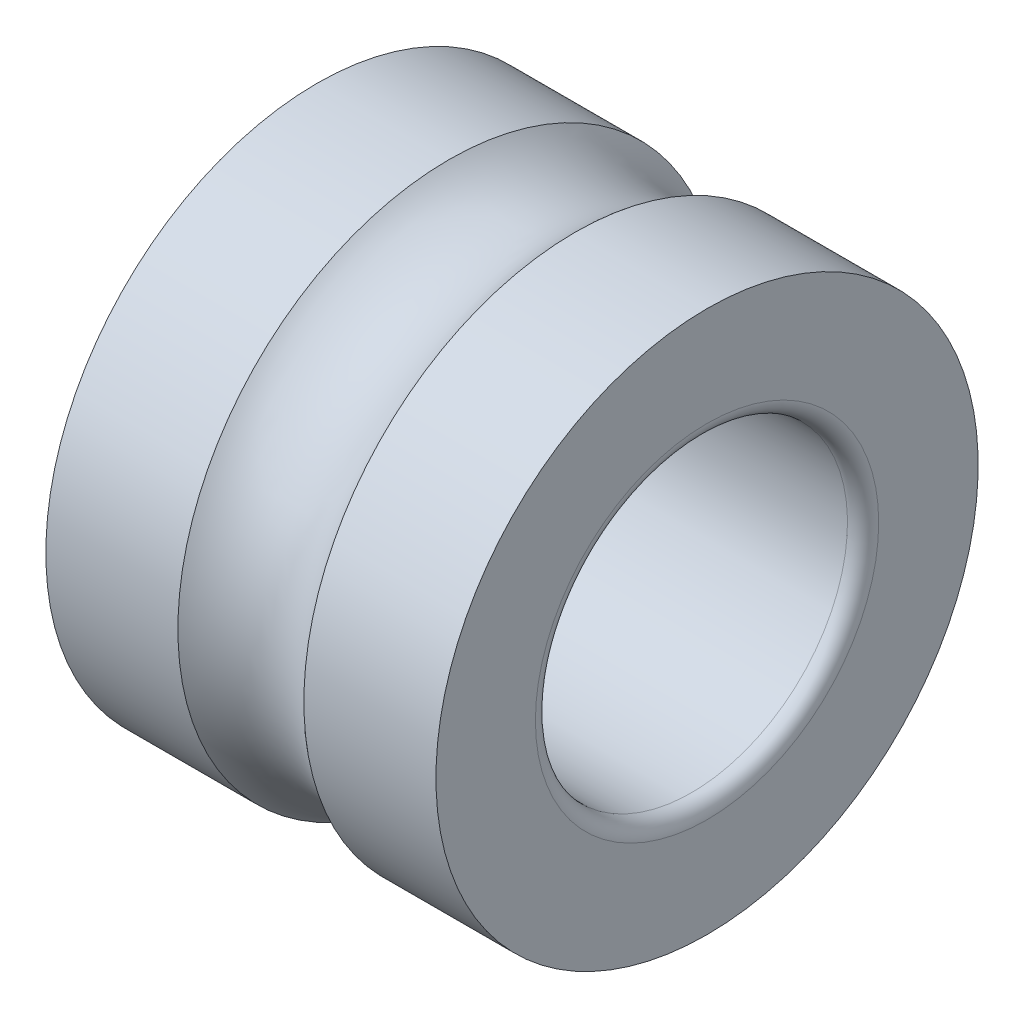
ISO-10303-21;
HEADER;
FILE_DESCRIPTION(('STEP AP214'),'2;1');
FILE_NAME('part.step','',(''),(''),'','','');
FILE_SCHEMA(('AUTOMOTIVE_DESIGN { 1 0 10303 214 1 1 1 1 }'));
ENDSEC;
DATA;
#1=APPLICATION_CONTEXT('core data for automotive mechanical design processes');
#2=APPLICATION_PROTOCOL_DEFINITION('international standard','automotive_design',2000,#1);
#3=PRODUCT_CONTEXT('',#1,'mechanical');
#4=PRODUCT('Part','Part','',(#3));
#5=PRODUCT_RELATED_PRODUCT_CATEGORY('part','',(#4));
#6=PRODUCT_DEFINITION_FORMATION('','',#4);
#7=PRODUCT_DEFINITION_CONTEXT('part definition',#1,'design');
#8=PRODUCT_DEFINITION('design','',#6,#7);
#9=PRODUCT_DEFINITION_SHAPE('','',#8);
#10=(LENGTH_UNIT() NAMED_UNIT(*) SI_UNIT(.MILLI.,.METRE.));
#11=(NAMED_UNIT(*) PLANE_ANGLE_UNIT() SI_UNIT($,.RADIAN.));
#12=(NAMED_UNIT(*) SI_UNIT($,.STERADIAN.) SOLID_ANGLE_UNIT());
#13=UNCERTAINTY_MEASURE_WITH_UNIT(LENGTH_MEASURE(1.E-05),#10,'distance_accuracy_value','');
#14=(GEOMETRIC_REPRESENTATION_CONTEXT(3) GLOBAL_UNCERTAINTY_ASSIGNED_CONTEXT((#13)) GLOBAL_UNIT_ASSIGNED_CONTEXT((#10,
#11,#12)) REPRESENTATION_CONTEXT('',''));
#15=CARTESIAN_POINT('',(0.,0.,0.));
#16=DIRECTION('',(0.,0.,1.));
#17=DIRECTION('',(1.,0.,0.));
#18=AXIS2_PLACEMENT_3D('',#15,#16,#17);
#19=CARTESIAN_POINT('',(4.15362892921594,0.,0.));
#20=DIRECTION('',(-1.,0.,0.));
#21=DIRECTION('',(0.,1.,0.));
#22=AXIS2_PLACEMENT_3D('',#19,#20,#21);
#23=CYLINDRICAL_SURFACE('',#22,3.475);
#24=CARTESIAN_POINT('',(3.30725785843187,0.,0.));
#25=DIRECTION('',(1.,0.,0.));
#26=DIRECTION('',(0.,1.,0.));
#27=AXIS2_PLACEMENT_3D('',#24,#25,#26);
#28=CIRCLE('',#27,3.475);
#29=CARTESIAN_POINT('',(3.30725785843187,3.475,0.));
#30=VERTEX_POINT('',#29);
#31=EDGE_CURVE('E11',#30,#30,#28,.T.);
#32=ORIENTED_EDGE('',*,*,#31,.T.);
#33=EDGE_LOOP('',(#32));
#34=FACE_BOUND('',#33,.T.);
#35=CARTESIAN_POINT('',(5.,0.,0.));
#36=DIRECTION('',(1.,0.,0.));
#37=DIRECTION('',(0.,1.,0.));
#38=AXIS2_PLACEMENT_3D('',#35,#36,#37);
#39=CIRCLE('',#38,3.475);
#40=CARTESIAN_POINT('',(5.,3.475,0.));
#41=VERTEX_POINT('',#40);
#42=EDGE_CURVE('E52',#41,#41,#39,.T.);
#43=ORIENTED_EDGE('',*,*,#42,.F.);
#44=EDGE_LOOP('',(#43));
#45=FACE_BOUND('',#44,.T.);
#46=ADVANCED_FACE('F16',(#34,#45),#23,.T.);
#47=CARTESIAN_POINT('',(2.5,0.,0.));
#48=DIRECTION('',(1.,0.,0.));
#49=DIRECTION('',(0.,0.,-1.));
#50=AXIS2_PLACEMENT_3D('',#47,#48,#49);
#51=TOROIDAL_SURFACE('',#50,4.35,1.1905);
#52=CARTESIAN_POINT('',(1.69274214156813,0.,0.));
#53=DIRECTION('',(1.,0.,0.));
#54=DIRECTION('',(0.,1.,0.));
#55=AXIS2_PLACEMENT_3D('',#52,#53,#54);
#56=CIRCLE('',#55,3.475);
#57=CARTESIAN_POINT('',(1.69274214156813,3.475,0.));
#58=VERTEX_POINT('',#57);
#59=EDGE_CURVE('E26',#58,#58,#56,.T.);
#60=ORIENTED_EDGE('',*,*,#59,.T.);
#61=EDGE_LOOP('',(#60));
#62=FACE_BOUND('',#61,.T.);
#63=ORIENTED_EDGE('',*,*,#31,.F.);
#64=EDGE_LOOP('',(#63));
#65=FACE_BOUND('',#64,.T.);
#66=ADVANCED_FACE('F72',(#62,#65),#51,.F.);
#67=CARTESIAN_POINT('',(0.846371070784067,0.,0.));
#68=DIRECTION('',(-1.,0.,0.));
#69=DIRECTION('',(0.,1.,0.));
#70=AXIS2_PLACEMENT_3D('',#67,#68,#69);
#71=CYLINDRICAL_SURFACE('',#70,3.475);
#72=CARTESIAN_POINT('',(0.,0.,0.));
#73=DIRECTION('',(1.,0.,0.));
#74=DIRECTION('',(0.,1.,0.));
#75=AXIS2_PLACEMENT_3D('',#72,#73,#74);
#76=CIRCLE('',#75,3.475);
#77=CARTESIAN_POINT('',(0.,3.475,0.));
#78=VERTEX_POINT('',#77);
#79=EDGE_CURVE('E56',#78,#78,#76,.T.);
#80=ORIENTED_EDGE('',*,*,#79,.T.);
#81=EDGE_LOOP('',(#80));
#82=FACE_BOUND('',#81,.T.);
#83=ORIENTED_EDGE('',*,*,#59,.F.);
#84=EDGE_LOOP('',(#83));
#85=FACE_BOUND('',#84,.T.);
#86=ADVANCED_FACE('F75',(#82,#85),#71,.T.);
#87=CARTESIAN_POINT('',(0.,2.8375,0.));
#88=DIRECTION('',(-1.,0.,0.));
#89=DIRECTION('',(0.,-1.,0.));
#90=AXIS2_PLACEMENT_3D('',#87,#88,#89);
#91=PLANE('',#90);
#92=CARTESIAN_POINT('',(0.,0.,0.));
#93=DIRECTION('',(1.,0.,0.));
#94=DIRECTION('',(0.,1.,0.));
#95=AXIS2_PLACEMENT_3D('',#92,#93,#94);
#96=CIRCLE('',#95,2.2);
#97=CARTESIAN_POINT('',(0.,2.2,0.));
#98=VERTEX_POINT('',#97);
#99=EDGE_CURVE('E60',#98,#98,#96,.T.);
#100=ORIENTED_EDGE('',*,*,#99,.T.);
#101=EDGE_LOOP('',(#100));
#102=FACE_BOUND('',#101,.T.);
#103=ORIENTED_EDGE('',*,*,#79,.F.);
#104=EDGE_LOOP('',(#103));
#105=FACE_BOUND('',#104,.T.);
#106=ADVANCED_FACE('F61',(#102,#105),#91,.T.);
#107=CARTESIAN_POINT('',(0.2,0.,0.));
#108=DIRECTION('',(1.,0.,0.));
#109=DIRECTION('',(0.,0.,-1.));
#110=AXIS2_PLACEMENT_3D('',#107,#108,#109);
#111=TOROIDAL_SURFACE('',#110,2.2,0.2);
#112=CARTESIAN_POINT('',(0.2,0.,0.));
#113=DIRECTION('',(1.,0.,0.));
#114=DIRECTION('',(0.,1.,0.));
#115=AXIS2_PLACEMENT_3D('',#112,#113,#114);
#116=CIRCLE('',#115,2.);
#117=CARTESIAN_POINT('',(0.2,2.,0.));
#118=VERTEX_POINT('',#117);
#119=EDGE_CURVE('E20',#118,#118,#116,.T.);
#120=ORIENTED_EDGE('',*,*,#119,.T.);
#121=EDGE_LOOP('',(#120));
#122=FACE_BOUND('',#121,.T.);
#123=ORIENTED_EDGE('',*,*,#99,.F.);
#124=EDGE_LOOP('',(#123));
#125=FACE_BOUND('',#124,.T.);
#126=ADVANCED_FACE('F83',(#122,#125),#111,.T.);
#127=CARTESIAN_POINT('',(2.5,0.,0.));
#128=DIRECTION('',(-1.,0.,0.));
#129=DIRECTION('',(0.,1.,0.));
#130=AXIS2_PLACEMENT_3D('',#127,#128,#129);
#131=CYLINDRICAL_SURFACE('',#130,2.);
#132=CARTESIAN_POINT('',(4.8,0.,0.));
#133=DIRECTION('',(1.,0.,0.));
#134=DIRECTION('',(0.,1.,0.));
#135=AXIS2_PLACEMENT_3D('',#132,#133,#134);
#136=CIRCLE('',#135,2.);
#137=CARTESIAN_POINT('',(4.8,2.,0.));
#138=VERTEX_POINT('',#137);
#139=EDGE_CURVE('E46',#138,#138,#136,.T.);
#140=ORIENTED_EDGE('',*,*,#139,.T.);
#141=EDGE_LOOP('',(#140));
#142=FACE_BOUND('',#141,.T.);
#143=ORIENTED_EDGE('',*,*,#119,.F.);
#144=EDGE_LOOP('',(#143));
#145=FACE_BOUND('',#144,.T.);
#146=ADVANCED_FACE('F18',(#142,#145),#131,.F.);
#147=CARTESIAN_POINT('',(4.8,0.,0.));
#148=DIRECTION('',(1.,0.,0.));
#149=DIRECTION('',(0.,0.,-1.));
#150=AXIS2_PLACEMENT_3D('',#147,#148,#149);
#151=TOROIDAL_SURFACE('',#150,2.2,0.2);
#152=CARTESIAN_POINT('',(5.,0.,0.));
#153=DIRECTION('',(1.,0.,0.));
#154=DIRECTION('',(0.,1.,0.));
#155=AXIS2_PLACEMENT_3D('',#152,#153,#154);
#156=CIRCLE('',#155,2.2);
#157=CARTESIAN_POINT('',(5.,2.2,0.));
#158=VERTEX_POINT('',#157);
#159=EDGE_CURVE('E68',#158,#158,#156,.T.);
#160=ORIENTED_EDGE('',*,*,#159,.T.);
#161=EDGE_LOOP('',(#160));
#162=FACE_BOUND('',#161,.T.);
#163=ORIENTED_EDGE('',*,*,#139,.F.);
#164=EDGE_LOOP('',(#163));
#165=FACE_BOUND('',#164,.T.);
#166=ADVANCED_FACE('F95',(#162,#165),#151,.T.);
#167=CARTESIAN_POINT('',(5.,2.8375,0.));
#168=DIRECTION('',(1.,0.,0.));
#169=DIRECTION('',(0.,1.,0.));
#170=AXIS2_PLACEMENT_3D('',#167,#168,#169);
#171=PLANE('',#170);
#172=ORIENTED_EDGE('',*,*,#42,.T.);
#173=EDGE_LOOP('',(#172));
#174=FACE_BOUND('',#173,.T.);
#175=ORIENTED_EDGE('',*,*,#159,.F.);
#176=EDGE_LOOP('',(#175));
#177=FACE_BOUND('',#176,.T.);
#178=ADVANCED_FACE('F93',(#174,#177),#171,.T.);
#179=CLOSED_SHELL('',(#46,#66,#86,#106,#126,#146,#166,#178));
#180=MANIFOLD_SOLID_BREP('B1',#179);
#181=ADVANCED_BREP_SHAPE_REPRESENTATION('',(#18,#180),#14);
#182=SHAPE_DEFINITION_REPRESENTATION(#9,#181);
ENDSEC;
END-ISO-10303-21;
